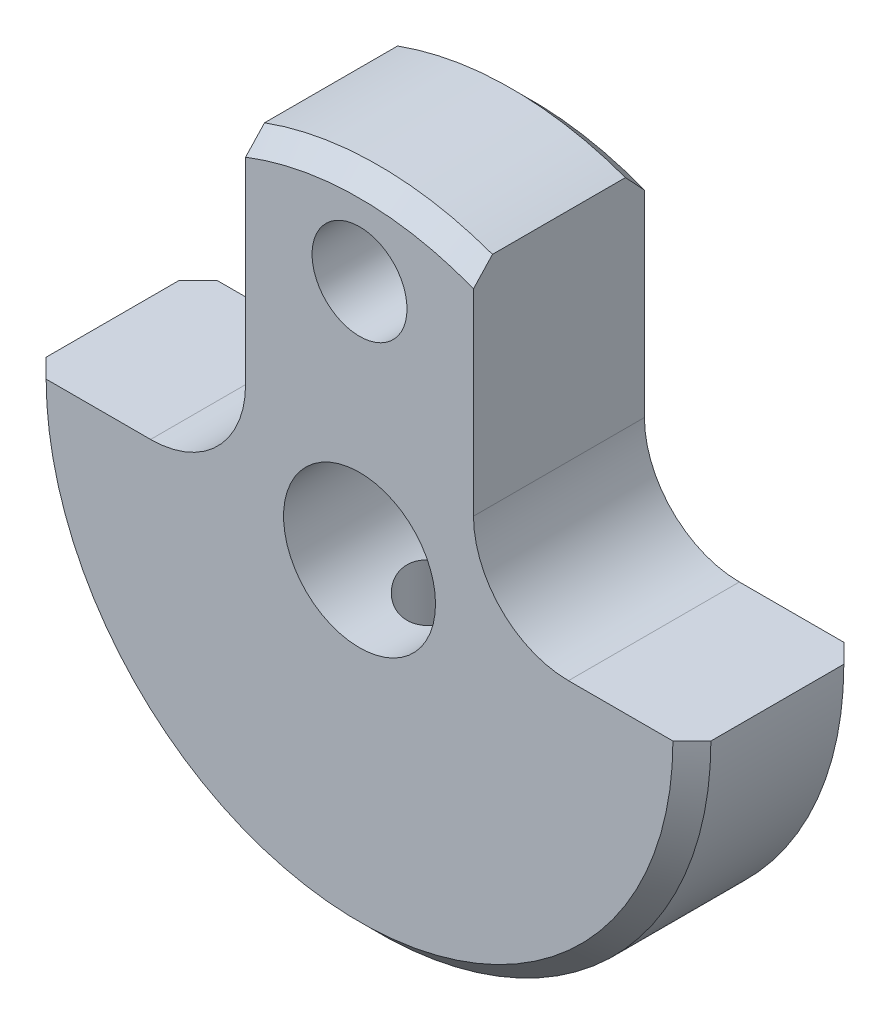
ISO-10303-21;
HEADER;
FILE_DESCRIPTION(('STEP AP214'),'2;1');
FILE_NAME('part.step','',(''),(''),'','','');
FILE_SCHEMA(('AUTOMOTIVE_DESIGN { 1 0 10303 214 1 1 1 1 }'));
ENDSEC;
DATA;
#1=APPLICATION_CONTEXT('core data for automotive mechanical design processes');
#2=APPLICATION_PROTOCOL_DEFINITION('international standard','automotive_design',2000,#1);
#3=PRODUCT_CONTEXT('',#1,'mechanical');
#4=PRODUCT('Part','Part','',(#3));
#5=PRODUCT_RELATED_PRODUCT_CATEGORY('part','',(#4));
#6=PRODUCT_DEFINITION_FORMATION('','',#4);
#7=PRODUCT_DEFINITION_CONTEXT('part definition',#1,'design');
#8=PRODUCT_DEFINITION('design','',#6,#7);
#9=PRODUCT_DEFINITION_SHAPE('','',#8);
#10=(LENGTH_UNIT() NAMED_UNIT(*) SI_UNIT(.MILLI.,.METRE.));
#11=(NAMED_UNIT(*) PLANE_ANGLE_UNIT() SI_UNIT($,.RADIAN.));
#12=(NAMED_UNIT(*) SI_UNIT($,.STERADIAN.) SOLID_ANGLE_UNIT());
#13=UNCERTAINTY_MEASURE_WITH_UNIT(LENGTH_MEASURE(1.E-05),#10,'distance_accuracy_value','');
#14=(GEOMETRIC_REPRESENTATION_CONTEXT(3) GLOBAL_UNCERTAINTY_ASSIGNED_CONTEXT((#13)) GLOBAL_UNIT_ASSIGNED_CONTEXT((#10,
#11,#12)) REPRESENTATION_CONTEXT('',''));
#15=CARTESIAN_POINT('',(0.,0.,0.));
#16=DIRECTION('',(0.,0.,1.));
#17=DIRECTION('',(1.,0.,0.));
#18=AXIS2_PLACEMENT_3D('',#15,#16,#17);
#19=CARTESIAN_POINT('',(0.,0.,4.5));
#20=DIRECTION('',(0.,0.,-1.));
#21=DIRECTION('',(-1.,0.,0.));
#22=AXIS2_PLACEMENT_3D('',#19,#20,#21);
#23=CYLINDRICAL_SURFACE('',#22,17.5);
#24=DIRECTION('',(0.,0.,-1.));
#25=VECTOR('',#24,1.);
#26=CARTESIAN_POINT('',(6.,16.4392822227736,4.5));
#27=LINE('',#26,#25);
#28=CARTESIAN_POINT('',(6.,16.4392822227736,3.49999999999998));
#29=VERTEX_POINT('',#28);
#30=CARTESIAN_POINT('',(6.,16.4392822227736,-3.5));
#31=VERTEX_POINT('',#30);
#32=EDGE_CURVE('E181',#29,#31,#27,.T.);
#33=ORIENTED_EDGE('',*,*,#32,.T.);
#34=CARTESIAN_POINT('',(0.,0.,-3.5));
#35=DIRECTION('',(0.,0.,1.));
#36=DIRECTION('',(1.,0.,0.));
#37=AXIS2_PLACEMENT_3D('',#34,#35,#36);
#38=CIRCLE('',#37,17.5);
#39=CARTESIAN_POINT('',(-6.,16.4392822227736,-3.5));
#40=VERTEX_POINT('',#39);
#41=EDGE_CURVE('E338',#31,#40,#38,.T.);
#42=ORIENTED_EDGE('',*,*,#41,.T.);
#43=DIRECTION('',(0.,0.,-1.));
#44=VECTOR('',#43,1.);
#45=CARTESIAN_POINT('',(-6.,16.4392822227736,4.5));
#46=LINE('',#45,#44);
#47=CARTESIAN_POINT('',(-6.,16.4392822227736,3.49999999999998));
#48=VERTEX_POINT('',#47);
#49=EDGE_CURVE('E159',#48,#40,#46,.T.);
#50=ORIENTED_EDGE('',*,*,#49,.F.);
#51=CARTESIAN_POINT('',(0.,0.,3.49999999999998));
#52=DIRECTION('',(0.,0.,1.));
#53=DIRECTION('',(1.,0.,0.));
#54=AXIS2_PLACEMENT_3D('',#51,#52,#53);
#55=CIRCLE('',#54,17.5);
#56=EDGE_CURVE('E222',#48,#29,#55,.F.);
#57=ORIENTED_EDGE('',*,*,#56,.T.);
#58=EDGE_LOOP('',(#33,#42,#50,#57));
#59=FACE_BOUND('',#58,.T.);
#60=ADVANCED_FACE('F45',(#59),#23,.T.);
#61=CARTESIAN_POINT('',(-6.,16.4392822227736,4.5));
#62=DIRECTION('',(1.,0.,0.));
#63=DIRECTION('',(0.,1.,0.));
#64=AXIS2_PLACEMENT_3D('',#61,#62,#63);
#65=PLANE('',#64);
#66=ORIENTED_EDGE('',*,*,#49,.T.);
#67=CARTESIAN_POINT('',(-6.,16.4392822227736,-3.5));
#68=CARTESIAN_POINT('',(-6.,16.2614879278329,-3.6670390275826));
#69=CARTESIAN_POINT('',(-6.,16.0835194437437,-3.83389187203582));
#70=CARTESIAN_POINT('',(-6.,15.7272340858214,-4.16722520539308));
#71=CARTESIAN_POINT('',(-6.,15.5489172119658,-4.33370569427319));
#72=CARTESIAN_POINT('',(-6.,15.3704261489394,-4.5));
#73=B_SPLINE_CURVE_WITH_KNOTS('',3,(#67,#68,#69,#70,#71,#72),.UNSPECIFIED.,.F.,.F.,(4,2,4),(0.,
0.731856459478371,1.46371296598383),.UNSPECIFIED.);
#74=CARTESIAN_POINT('',(-6.,15.3704261489394,-4.5));
#75=VERTEX_POINT('',#74);
#76=EDGE_CURVE('E279',#40,#75,#73,.T.);
#77=ORIENTED_EDGE('',*,*,#76,.T.);
#78=DIRECTION('',(0.,-1.,0.));
#79=VECTOR('',#78,1.);
#80=CARTESIAN_POINT('',(-6.,16.4392822227736,-4.5));
#81=LINE('',#80,#79);
#82=CARTESIAN_POINT('',(-6.,5.,-4.5));
#83=VERTEX_POINT('',#82);
#84=EDGE_CURVE('E155',#75,#83,#81,.T.);
#85=ORIENTED_EDGE('',*,*,#84,.T.);
#86=DIRECTION('',(0.,0.,-1.));
#87=VECTOR('',#86,1.);
#88=CARTESIAN_POINT('',(-6.,5.,4.5));
#89=LINE('',#88,#87);
#90=CARTESIAN_POINT('',(-6.,5.,4.5));
#91=VERTEX_POINT('',#90);
#92=EDGE_CURVE('E151',#91,#83,#89,.T.);
#93=ORIENTED_EDGE('',*,*,#92,.F.);
#94=DIRECTION('',(0.,-1.,0.));
#95=VECTOR('',#94,1.);
#96=CARTESIAN_POINT('',(-6.,16.4392822227736,4.5));
#97=LINE('',#96,#95);
#98=CARTESIAN_POINT('',(-6.,15.3704261489394,4.5));
#99=VERTEX_POINT('',#98);
#100=EDGE_CURVE('E136',#99,#91,#97,.T.);
#101=ORIENTED_EDGE('',*,*,#100,.F.);
#102=CARTESIAN_POINT('',(-6.,15.3704261489394,4.5));
#103=CARTESIAN_POINT('',(-6.,15.5489172119658,4.33370569427319));
#104=CARTESIAN_POINT('',(-6.,15.7272340858214,4.16722520539308));
#105=CARTESIAN_POINT('',(-6.,16.0835194437437,3.83389187203581));
#106=CARTESIAN_POINT('',(-6.,16.2614879278329,3.66703902758258));
#107=CARTESIAN_POINT('',(-6.,16.4392822227736,3.49999999999998));
#108=B_SPLINE_CURVE_WITH_KNOTS('',3,(#102,#103,#104,#105,#106,#107),.UNSPECIFIED.,.F.,.F.,(4,2,
4),(0.,0.731856506505467,1.46371296598385),.UNSPECIFIED.);
#109=EDGE_CURVE('E272',#99,#48,#108,.T.);
#110=ORIENTED_EDGE('',*,*,#109,.T.);
#111=EDGE_LOOP('',(#66,#77,#85,#93,#101,#110));
#112=FACE_BOUND('',#111,.T.);
#113=ADVANCED_FACE('F153',(#112),#65,.F.);
#114=CARTESIAN_POINT('',(-11.,5.,4.5));
#115=DIRECTION('',(0.,0.,-1.));
#116=DIRECTION('',(-1.,0.,0.));
#117=AXIS2_PLACEMENT_3D('',#114,#115,#116);
#118=CYLINDRICAL_SURFACE('',#117,5.);
#119=CARTESIAN_POINT('',(-11.,5.,-4.5));
#120=DIRECTION('',(0.,0.,-1.));
#121=DIRECTION('',(1.,0.,0.));
#122=AXIS2_PLACEMENT_3D('',#119,#120,#121);
#123=CIRCLE('',#122,5.);
#124=CARTESIAN_POINT('',(-11.,0.,-4.5));
#125=VERTEX_POINT('',#124);
#126=EDGE_CURVE('E184',#83,#125,#123,.T.);
#127=ORIENTED_EDGE('',*,*,#126,.T.);
#128=DIRECTION('',(0.,0.,-1.));
#129=VECTOR('',#128,1.);
#130=CARTESIAN_POINT('',(-11.,0.,4.5));
#131=LINE('',#130,#129);
#132=CARTESIAN_POINT('',(-11.,0.,4.5));
#133=VERTEX_POINT('',#132);
#134=EDGE_CURVE('E160',#133,#125,#131,.T.);
#135=ORIENTED_EDGE('',*,*,#134,.F.);
#136=CARTESIAN_POINT('',(-11.,5.,4.5));
#137=DIRECTION('',(0.,0.,-1.));
#138=DIRECTION('',(1.,0.,0.));
#139=AXIS2_PLACEMENT_3D('',#136,#137,#138);
#140=CIRCLE('',#139,5.);
#141=EDGE_CURVE('E142',#91,#133,#140,.T.);
#142=ORIENTED_EDGE('',*,*,#141,.F.);
#143=ORIENTED_EDGE('',*,*,#92,.T.);
#144=EDGE_LOOP('',(#127,#135,#142,#143));
#145=FACE_BOUND('',#144,.T.);
#146=ADVANCED_FACE('F162',(#145),#118,.F.);
#147=CARTESIAN_POINT('',(-11.,0.,4.5));
#148=DIRECTION('',(0.,-1.,0.));
#149=DIRECTION('',(0.,0.,-1.));
#150=AXIS2_PLACEMENT_3D('',#147,#148,#149);
#151=PLANE('',#150);
#152=DIRECTION('',(-1.,0.,0.));
#153=VECTOR('',#152,1.);
#154=CARTESIAN_POINT('',(-11.,0.,-4.5));
#155=LINE('',#154,#153);
#156=CARTESIAN_POINT('',(-16.5,0.,-4.5));
#157=VERTEX_POINT('',#156);
#158=EDGE_CURVE('E188',#125,#157,#155,.T.);
#159=ORIENTED_EDGE('',*,*,#158,.T.);
#160=DIRECTION('',(0.707106781186547,0.,-0.707106781186548));
#161=VECTOR('',#160,1.);
#162=CARTESIAN_POINT('',(0.,0.,-21.));
#163=LINE('',#162,#161);
#164=CARTESIAN_POINT('',(-17.5,0.,-3.49999999999999));
#165=VERTEX_POINT('',#164);
#166=EDGE_CURVE('E11',#157,#165,#163,.F.);
#167=ORIENTED_EDGE('',*,*,#166,.T.);
#168=DIRECTION('',(0.,0.,-1.));
#169=VECTOR('',#168,1.);
#170=CARTESIAN_POINT('',(-17.5,0.,4.5));
#171=LINE('',#170,#169);
#172=CARTESIAN_POINT('',(-17.5,0.,3.49999999999999));
#173=VERTEX_POINT('',#172);
#174=EDGE_CURVE('E215',#173,#165,#171,.T.);
#175=ORIENTED_EDGE('',*,*,#174,.F.);
#176=DIRECTION('',(-0.707106781186549,0.,-0.707106781186546));
#177=VECTOR('',#176,1.);
#178=CARTESIAN_POINT('',(0.,0.,20.9999999999999));
#179=LINE('',#178,#177);
#180=CARTESIAN_POINT('',(-16.5,0.,4.5));
#181=VERTEX_POINT('',#180);
#182=EDGE_CURVE('E55',#173,#181,#179,.F.);
#183=ORIENTED_EDGE('',*,*,#182,.T.);
#184=DIRECTION('',(-1.,0.,0.));
#185=VECTOR('',#184,1.);
#186=CARTESIAN_POINT('',(-11.,0.,4.5));
#187=LINE('',#186,#185);
#188=EDGE_CURVE('E166',#133,#181,#187,.T.);
#189=ORIENTED_EDGE('',*,*,#188,.F.);
#190=ORIENTED_EDGE('',*,*,#134,.T.);
#191=EDGE_LOOP('',(#159,#167,#175,#183,#189,#190));
#192=FACE_BOUND('',#191,.T.);
#193=ADVANCED_FACE('F259',(#192),#151,.F.);
#194=CARTESIAN_POINT('',(0.,0.,4.5));
#195=DIRECTION('',(0.,0.,-1.));
#196=DIRECTION('',(-1.,0.,0.));
#197=AXIS2_PLACEMENT_3D('',#194,#195,#196);
#198=CYLINDRICAL_SURFACE('',#197,17.5);
#199=CARTESIAN_POINT('',(0.,-17.5,2.));
#200=CARTESIAN_POINT('',(0.111949281131271,-17.4999985510682,1.99999519972221));
#201=CARTESIAN_POINT('',(0.223970370284168,-17.4989143966958,1.9905688469133));
#202=CARTESIAN_POINT('',(0.444900622583234,-17.4946937577693,1.95311111433452));
#203=CARTESIAN_POINT('',(0.553806324423903,-17.4915550764498,1.92505981972606));
#204=CARTESIAN_POINT('',(0.765274995712128,-17.4835792974507,1.85118493954277));
#205=CARTESIAN_POINT('',(0.867841986694445,-17.4787432899077,1.80537275922766));
#206=CARTESIAN_POINT('',(1.06381060236176,-17.4679120331755,1.69730025928979));
#207=CARTESIAN_POINT('',(1.15721390847253,-17.4619169972561,1.63504296491735));
#208=CARTESIAN_POINT('',(1.33265783514777,-17.4494069384049,1.49553827629261));
#209=CARTESIAN_POINT('',(1.41464987662083,-17.4428898679339,1.41822996562049));
#210=CARTESIAN_POINT('',(1.56452579579969,-17.4300869526196,1.25094824366483));
#211=CARTESIAN_POINT('',(1.63240898570475,-17.4238011190613,1.16097421529119));
#212=CARTESIAN_POINT('',(1.75231750467917,-17.4121519566138,0.970604232540961));
#213=CARTESIAN_POINT('',(1.80429797266076,-17.4067912557056,0.870179846835984));
#214=CARTESIAN_POINT('',(1.89063905410776,-17.3976257108765,0.661956037568454));
#215=CARTESIAN_POINT('',(1.92500022892039,-17.3938208173886,0.554156849089708));
#216=CARTESIAN_POINT('',(1.97498120601605,-17.3882168566911,0.334744186795485));
#217=CARTESIAN_POINT('',(1.99068245631194,-17.3864090748178,0.223149492773668));
#218=CARTESIAN_POINT('',(2.00314979639016,-17.3849772070577,-0.00110459341705598));
#219=CARTESIAN_POINT('',(1.99991652712141,-17.3853530472536,-0.1137639494174));
#220=CARTESIAN_POINT('',(1.9746735877826,-17.3882379876878,-0.336384576951136));
#221=CARTESIAN_POINT('',(1.95275327430006,-17.3907369355841,-0.446356130792127));
#222=CARTESIAN_POINT('',(1.89089772862114,-17.3975706833084,-0.661049381098405));
#223=CARTESIAN_POINT('',(1.85096218648165,-17.4019055147219,-0.765770987206493));
#224=CARTESIAN_POINT('',(1.75411258690629,-17.4119342022004,-0.967271409063269));
#225=CARTESIAN_POINT('',(1.697159329054,-17.4176311898807,-1.0640312212313));
#226=CARTESIAN_POINT('',(1.5679190891396,-17.4297397716759,-1.24665329274372));
#227=CARTESIAN_POINT('',(1.49563152051157,-17.4361513931222,-1.33251513501963));
#228=CARTESIAN_POINT('',(1.33727766100704,-17.4490120091816,-1.49142289169273));
#229=CARTESIAN_POINT('',(1.25113428048549,-17.4554610059959,-1.56439200697674));
#230=CARTESIAN_POINT('',(1.06778054344645,-17.4676349914203,-1.69484625362185));
#231=CARTESIAN_POINT('',(0.970570168013122,-17.4733599787928,-1.75233135851693));
#232=CARTESIAN_POINT('',(0.767785399909199,-17.4834436495983,-1.85018441798749));
#233=CARTESIAN_POINT('',(0.662208868897606,-17.487801982302,-1.89054797953882));
#234=CARTESIAN_POINT('',(0.445716005555924,-17.4946579437091,-1.95295335032392));
#235=CARTESIAN_POINT('',(0.33479988217787,-17.4971556451608,-1.97499587589154));
#236=CARTESIAN_POINT('',(0.111440847189143,-17.4999995196358,-2.00003489194185));
#237=CARTESIAN_POINT('',(-0.000990049263884275,-17.5003576527763,-2.00313725942906));
#238=CARTESIAN_POINT('',(-0.224770143214528,-17.4989142301576,-1.99048670077362));
#239=CARTESIAN_POINT('',(-0.336119359859263,-17.4971127126976,-1.97473410900327));
#240=CARTESIAN_POINT('',(-0.554265994438542,-17.4915599395695,-1.9249086964044));
#241=CARTESIAN_POINT('',(-0.661074995715398,-17.4878140135584,-1.89088594563397));
#242=CARTESIAN_POINT('',(-0.86747060654654,-17.4787921749894,-1.80553777762337));
#243=CARTESIAN_POINT('',(-0.967057008006426,-17.4735162183709,-1.75421186209241));
#244=CARTESIAN_POINT('',(-1.1566560556988,-17.4619935546906,-1.63545523933527));
#245=CARTESIAN_POINT('',(-1.24662524248109,-17.4557427309721,-1.56795555368873));
#246=CARTESIAN_POINT('',(-1.41399482686995,-17.4429836190554,-1.41886564059422));
#247=CARTESIAN_POINT('',(-1.49139480973755,-17.4364753223705,-1.33727494837641));
#248=CARTESIAN_POINT('',(-1.63180089287333,-17.4238982965486,-1.16185467559832));
#249=CARTESIAN_POINT('',(-1.69473712215655,-17.4178317940395,-1.06796898786935));
#250=CARTESIAN_POINT('',(-1.80394755942104,-17.4068606742743,-0.870898077949681));
#251=CARTESIAN_POINT('',(-1.85022205420212,-17.4019560370195,-0.767713015868109));
#252=CARTESIAN_POINT('',(-1.92468057699606,-17.3938786287494,-0.555204287235232));
#253=CARTESIAN_POINT('',(-1.9529049884149,-17.3907019940762,-0.445894923210457));
#254=CARTESIAN_POINT('',(-1.99059267414119,-17.3864287991637,-0.22404998907473));
#255=CARTESIAN_POINT('',(-2.00005666745658,-17.385332159207,-0.111514542773653));
#256=CARTESIAN_POINT('',(-1.99994314687055,-17.385345163739,0.112893307638868));
#257=CARTESIAN_POINT('',(-1.99047539100516,-17.3864420908835,0.224765784023057));
#258=CARTESIAN_POINT('',(-1.95299850876729,-17.3906913968281,0.44531898808805));
#259=CARTESIAN_POINT('',(-1.92498937098975,-17.3938437768924,0.553999713805521));
#260=CARTESIAN_POINT('',(-1.85125733006852,-17.4018450488478,0.765076043362252));
#261=CARTESIAN_POINT('',(-1.80553879088569,-17.4066935227579,0.867473188409542));
#262=CARTESIAN_POINT('',(-1.69769666392679,-17.4175414489812,1.06315918160624));
#263=CARTESIAN_POINT('',(-1.63557300493567,-17.4235409062907,1.15644799021371));
#264=CARTESIAN_POINT('',(-1.496274276119,-17.4360565183282,1.33183113362611));
#265=CARTESIAN_POINT('',(-1.41901733601474,-17.4425753637158,1.41386025390555));
#266=CARTESIAN_POINT('',(-1.25181311513089,-17.4553710614581,1.56383427394015));
#267=CARTESIAN_POINT('',(-1.16186282631113,-17.4616478560018,1.63177582580489));
#268=CARTESIAN_POINT('',(-0.971500170550116,-17.4732739611811,1.75182617233102));
#269=CARTESIAN_POINT('',(-0.871055194164788,-17.4786202345149,1.80388352106762));
#270=CARTESIAN_POINT('',(-0.662847939396798,-17.4877513427388,1.8903202121152));
#271=CARTESIAN_POINT('',(-0.555093898848711,-17.4915379025678,1.92471909393972));
#272=CARTESIAN_POINT('',(-0.372298085692646,-17.4961924479184,1.96647110226512));
#273=CARTESIAN_POINT('',(-0.298416630910324,-17.4976134605341,1.97902677875614));
#274=CARTESIAN_POINT('',(-0.149700818660187,-17.499517718344,1.99579280851968));
#275=CARTESIAN_POINT('',(-0.0748664667225642,-17.5000009689781,2.00000321020228));
#276=CARTESIAN_POINT('',(0.,-17.5,2.));
#277=B_SPLINE_CURVE_WITH_KNOTS('',3,(#199,#200,#201,#202,#203,#204,#205,#206,#207,#208,#209,
#210,#211,#212,#213,#214,#215,#216,#217,#218,#219,#220,#221,#222,#223,#224,#225,#226,#227,#228,
#229,#230,#231,#232,#233,#234,#235,#236,#237,#238,#239,#240,#241,#242,#243,#244,#245,#246,#247,
#248,#249,#250,#251,#252,#253,#254,#255,#256,#257,#258,#259,#260,#261,#262,#263,#264,#265,#266,
#267,#268,#269,#270,#271,#272,#273,#274,#275,#276),.UNSPECIFIED.,.T.,.F.,(4,2,2,2,2,2,2,2,2,2,2,
2,2,2,2,2,2,2,2,2,2,2,2,2,2,2,2,2,2,2,2,2,2,2,2,2,2,2,4),(0.,0.33557441666428,0.671508227518322,
1.00722667281621,1.34288340216198,1.67992799894876,2.01698902267013,2.3549922992977,
2.69298480653802,3.02949654002249,3.36599688237659,3.70089713523239,4.03580315010126,
4.3714866496878,4.7071829921089,5.04481612297898,5.38244983094421,5.72017011621975,
6.05787719635448,6.39369472529332,6.72950629895979,7.06440223033912,7.3993078067643,
7.73566795085562,8.07203919137998,8.41000271890796,8.74796042876378,9.08515935679784,
9.42234536116483,9.75758217571838,10.0928191964808,10.4279736604432,10.763129579344,
11.100151413458,11.4372532487619,11.7754355791756,12.1132428917892,12.3376607387197,
12.5620772838218),.UNSPECIFIED.);
#278=CARTESIAN_POINT('',(0.,-17.5,2.));
#279=VERTEX_POINT('',#278);
#280=EDGE_CURVE('E232',#279,#279,#277,.T.);
#281=ORIENTED_EDGE('',*,*,#280,.T.);
#282=EDGE_LOOP('',(#281));
#283=FACE_BOUND('',#282,.T.);
#284=ORIENTED_EDGE('',*,*,#174,.T.);
#285=CARTESIAN_POINT('',(0.,0.,-3.49999999999999));
#286=DIRECTION('',(0.,0.,1.));
#287=DIRECTION('',(1.,0.,0.));
#288=AXIS2_PLACEMENT_3D('',#285,#286,#287);
#289=CIRCLE('',#288,17.5);
#290=CARTESIAN_POINT('',(17.5,0.,-3.49999999999999));
#291=VERTEX_POINT('',#290);
#292=EDGE_CURVE('E362',#165,#291,#289,.T.);
#293=ORIENTED_EDGE('',*,*,#292,.T.);
#294=DIRECTION('',(0.,0.,-1.));
#295=VECTOR('',#294,1.);
#296=CARTESIAN_POINT('',(17.5,0.,4.5));
#297=LINE('',#296,#295);
#298=CARTESIAN_POINT('',(17.5,0.,3.49999999999999));
#299=VERTEX_POINT('',#298);
#300=EDGE_CURVE('E211',#299,#291,#297,.T.);
#301=ORIENTED_EDGE('',*,*,#300,.F.);
#302=CARTESIAN_POINT('',(0.,0.,3.49999999999999));
#303=DIRECTION('',(0.,0.,1.));
#304=DIRECTION('',(1.,0.,0.));
#305=AXIS2_PLACEMENT_3D('',#302,#303,#304);
#306=CIRCLE('',#305,17.5);
#307=EDGE_CURVE('E67',#299,#173,#306,.F.);
#308=ORIENTED_EDGE('',*,*,#307,.T.);
#309=EDGE_LOOP('',(#284,#293,#301,#308));
#310=FACE_BOUND('',#309,.T.);
#311=ADVANCED_FACE('F253',(#283,#310),#198,.T.);
#312=CARTESIAN_POINT('',(11.,0.,4.5));
#313=DIRECTION('',(0.,-1.,0.));
#314=DIRECTION('',(0.,0.,-1.));
#315=AXIS2_PLACEMENT_3D('',#312,#313,#314);
#316=PLANE('',#315);
#317=ORIENTED_EDGE('',*,*,#300,.T.);
#318=DIRECTION('',(0.707106781186547,0.,0.707106781186548));
#319=VECTOR('',#318,1.);
#320=CARTESIAN_POINT('',(0.,0.,-21.));
#321=LINE('',#320,#319);
#322=CARTESIAN_POINT('',(16.5,0.,-4.5));
#323=VERTEX_POINT('',#322);
#324=EDGE_CURVE('E363',#291,#323,#321,.F.);
#325=ORIENTED_EDGE('',*,*,#324,.T.);
#326=DIRECTION('',(-1.,0.,0.));
#327=VECTOR('',#326,1.);
#328=CARTESIAN_POINT('',(11.,0.,-4.5));
#329=LINE('',#328,#327);
#330=CARTESIAN_POINT('',(11.,0.,-4.5));
#331=VERTEX_POINT('',#330);
#332=EDGE_CURVE('E191',#323,#331,#329,.T.);
#333=ORIENTED_EDGE('',*,*,#332,.T.);
#334=DIRECTION('',(0.,0.,-1.));
#335=VECTOR('',#334,1.);
#336=CARTESIAN_POINT('',(11.,0.,4.5));
#337=LINE('',#336,#335);
#338=CARTESIAN_POINT('',(11.,0.,4.5));
#339=VERTEX_POINT('',#338);
#340=EDGE_CURVE('E207',#339,#331,#337,.T.);
#341=ORIENTED_EDGE('',*,*,#340,.F.);
#342=DIRECTION('',(-1.,0.,0.));
#343=VECTOR('',#342,1.);
#344=CARTESIAN_POINT('',(11.,0.,4.5));
#345=LINE('',#344,#343);
#346=CARTESIAN_POINT('',(16.5,0.,4.5));
#347=VERTEX_POINT('',#346);
#348=EDGE_CURVE('E169',#347,#339,#345,.T.);
#349=ORIENTED_EDGE('',*,*,#348,.F.);
#350=DIRECTION('',(-0.707106781186549,0.,0.707106781186546));
#351=VECTOR('',#350,1.);
#352=CARTESIAN_POINT('',(0.,0.,20.9999999999999));
#353=LINE('',#352,#351);
#354=EDGE_CURVE('E365',#347,#299,#353,.F.);
#355=ORIENTED_EDGE('',*,*,#354,.T.);
#356=EDGE_LOOP('',(#317,#325,#333,#341,#349,#355));
#357=FACE_BOUND('',#356,.T.);
#358=ADVANCED_FACE('F258',(#357),#316,.F.);
#359=CARTESIAN_POINT('',(11.,5.,4.5));
#360=DIRECTION('',(0.,0.,-1.));
#361=DIRECTION('',(-1.,0.,0.));
#362=AXIS2_PLACEMENT_3D('',#359,#360,#361);
#363=CYLINDRICAL_SURFACE('',#362,5.);
#364=CARTESIAN_POINT('',(11.,5.,-4.5));
#365=DIRECTION('',(0.,0.,-1.));
#366=DIRECTION('',(-1.,0.,0.));
#367=AXIS2_PLACEMENT_3D('',#364,#365,#366);
#368=CIRCLE('',#367,5.);
#369=CARTESIAN_POINT('',(6.,5.00000000000003,-4.5));
#370=VERTEX_POINT('',#369);
#371=EDGE_CURVE('E194',#331,#370,#368,.T.);
#372=ORIENTED_EDGE('',*,*,#371,.T.);
#373=DIRECTION('',(0.,0.,-1.));
#374=VECTOR('',#373,1.);
#375=CARTESIAN_POINT('',(6.,5.00000000000003,4.5));
#376=LINE('',#375,#374);
#377=CARTESIAN_POINT('',(6.,5.00000000000003,4.5));
#378=VERTEX_POINT('',#377);
#379=EDGE_CURVE('E203',#378,#370,#376,.T.);
#380=ORIENTED_EDGE('',*,*,#379,.F.);
#381=CARTESIAN_POINT('',(11.,5.,4.5));
#382=DIRECTION('',(0.,0.,-1.));
#383=DIRECTION('',(-1.,0.,0.));
#384=AXIS2_PLACEMENT_3D('',#381,#382,#383);
#385=CIRCLE('',#384,5.);
#386=EDGE_CURVE('E175',#339,#378,#385,.T.);
#387=ORIENTED_EDGE('',*,*,#386,.F.);
#388=ORIENTED_EDGE('',*,*,#340,.T.);
#389=EDGE_LOOP('',(#372,#380,#387,#388));
#390=FACE_BOUND('',#389,.T.);
#391=ADVANCED_FACE('F319',(#390),#363,.F.);
#392=CARTESIAN_POINT('',(6.,16.4392822227736,4.5));
#393=DIRECTION('',(-1.,0.,0.));
#394=DIRECTION('',(0.,-1.,0.));
#395=AXIS2_PLACEMENT_3D('',#392,#393,#394);
#396=PLANE('',#395);
#397=DIRECTION('',(0.,1.,0.));
#398=VECTOR('',#397,1.);
#399=CARTESIAN_POINT('',(6.,16.4392822227736,-4.5));
#400=LINE('',#399,#398);
#401=CARTESIAN_POINT('',(6.,15.3704261489394,-4.5));
#402=VERTEX_POINT('',#401);
#403=EDGE_CURVE('E148',#370,#402,#400,.T.);
#404=ORIENTED_EDGE('',*,*,#403,.T.);
#405=CARTESIAN_POINT('',(6.,15.3704261489394,-4.5));
#406=CARTESIAN_POINT('',(6.,15.5489172119658,-4.33370569427319));
#407=CARTESIAN_POINT('',(6.,15.7272340858214,-4.16722520539308));
#408=CARTESIAN_POINT('',(6.,16.0835194437437,-3.83389187203582));
#409=CARTESIAN_POINT('',(6.,16.2614879278329,-3.6670390275826));
#410=CARTESIAN_POINT('',(6.,16.4392822227736,-3.5));
#411=B_SPLINE_CURVE_WITH_KNOTS('',3,(#405,#406,#407,#408,#409,#410),.UNSPECIFIED.,.F.,.F.,(4,2,
4),(0.,0.731856506505456,1.46371296598383),.UNSPECIFIED.);
#412=EDGE_CURVE('E299',#402,#31,#411,.T.);
#413=ORIENTED_EDGE('',*,*,#412,.T.);
#414=ORIENTED_EDGE('',*,*,#32,.F.);
#415=CARTESIAN_POINT('',(6.,16.4392822227736,3.49999999999998));
#416=CARTESIAN_POINT('',(6.,16.2614879278329,3.66703902758258));
#417=CARTESIAN_POINT('',(6.,16.0835194437437,3.83389187203581));
#418=CARTESIAN_POINT('',(6.,15.7272340858214,4.16722520539308));
#419=CARTESIAN_POINT('',(6.,15.5489172119658,4.33370569427319));
#420=CARTESIAN_POINT('',(6.,15.3704261489394,4.5));
#421=B_SPLINE_CURVE_WITH_KNOTS('',3,(#415,#416,#417,#418,#419,#420),.UNSPECIFIED.,.F.,.F.,(4,2,
4),(0.,0.731856459478383,1.46371296598385),.UNSPECIFIED.);
#422=CARTESIAN_POINT('',(6.,15.3704261489394,4.5));
#423=VERTEX_POINT('',#422);
#424=EDGE_CURVE('E309',#29,#423,#421,.T.);
#425=ORIENTED_EDGE('',*,*,#424,.T.);
#426=DIRECTION('',(0.,1.,0.));
#427=VECTOR('',#426,1.);
#428=CARTESIAN_POINT('',(6.,16.4392822227736,4.5));
#429=LINE('',#428,#427);
#430=EDGE_CURVE('E178',#378,#423,#429,.T.);
#431=ORIENTED_EDGE('',*,*,#430,.F.);
#432=ORIENTED_EDGE('',*,*,#379,.T.);
#433=EDGE_LOOP('',(#404,#413,#414,#425,#431,#432));
#434=FACE_BOUND('',#433,.T.);
#435=ADVANCED_FACE('F315',(#434),#396,.F.);
#436=CARTESIAN_POINT('',(0.,0.,4.5));
#437=DIRECTION('',(0.,0.,1.));
#438=DIRECTION('',(1.,0.,0.));
#439=AXIS2_PLACEMENT_3D('',#436,#437,#438);
#440=PLANE('',#439);
#441=CARTESIAN_POINT('',(0.,0.,4.5));
#442=DIRECTION('',(0.,0.,1.));
#443=DIRECTION('',(1.,0.,0.));
#444=AXIS2_PLACEMENT_3D('',#441,#442,#443);
#445=CIRCLE('',#444,4.);
#446=CARTESIAN_POINT('',(4.,0.,4.5));
#447=VERTEX_POINT('',#446);
#448=EDGE_CURVE('E538',#447,#447,#445,.T.);
#449=ORIENTED_EDGE('',*,*,#448,.F.);
#450=EDGE_LOOP('',(#449));
#451=FACE_BOUND('',#450,.T.);
#452=CARTESIAN_POINT('',(0.,12.7,4.5));
#453=DIRECTION('',(0.,0.,1.));
#454=DIRECTION('',(1.,0.,0.));
#455=AXIS2_PLACEMENT_3D('',#452,#453,#454);
#456=CIRCLE('',#455,2.5);
#457=CARTESIAN_POINT('',(2.5,12.7,4.5));
#458=VERTEX_POINT('',#457);
#459=EDGE_CURVE('E541',#458,#458,#456,.T.);
#460=ORIENTED_EDGE('',*,*,#459,.F.);
#461=EDGE_LOOP('',(#460));
#462=FACE_BOUND('',#461,.T.);
#463=ORIENTED_EDGE('',*,*,#430,.T.);
#464=CARTESIAN_POINT('',(0.,0.,4.5));
#465=DIRECTION('',(0.,0.,1.));
#466=DIRECTION('',(1.,0.,0.));
#467=AXIS2_PLACEMENT_3D('',#464,#465,#466);
#468=CIRCLE('',#467,16.5);
#469=EDGE_CURVE('E145',#423,#99,#468,.T.);
#470=ORIENTED_EDGE('',*,*,#469,.T.);
#471=ORIENTED_EDGE('',*,*,#100,.T.);
#472=ORIENTED_EDGE('',*,*,#141,.T.);
#473=ORIENTED_EDGE('',*,*,#188,.T.);
#474=CARTESIAN_POINT('',(0.,0.,4.5));
#475=DIRECTION('',(0.,0.,1.));
#476=DIRECTION('',(1.,0.,0.));
#477=AXIS2_PLACEMENT_3D('',#474,#475,#476);
#478=CIRCLE('',#477,16.5);
#479=EDGE_CURVE('E308',#181,#347,#478,.T.);
#480=ORIENTED_EDGE('',*,*,#479,.T.);
#481=ORIENTED_EDGE('',*,*,#348,.T.);
#482=ORIENTED_EDGE('',*,*,#386,.T.);
#483=EDGE_LOOP('',(#463,#470,#471,#472,#473,#480,#481,#482));
#484=FACE_BOUND('',#483,.T.);
#485=ADVANCED_FACE('F139',(#451,#462,#484),#440,.T.);
#486=CARTESIAN_POINT('',(0.,0.,-4.5));
#487=DIRECTION('',(0.,0.,1.));
#488=DIRECTION('',(1.,0.,0.));
#489=AXIS2_PLACEMENT_3D('',#486,#487,#488);
#490=PLANE('',#489);
#491=CARTESIAN_POINT('',(0.,0.,-4.5));
#492=DIRECTION('',(0.,0.,1.));
#493=DIRECTION('',(1.,0.,0.));
#494=AXIS2_PLACEMENT_3D('',#491,#492,#493);
#495=CIRCLE('',#494,4.);
#496=CARTESIAN_POINT('',(4.,0.,-4.5));
#497=VERTEX_POINT('',#496);
#498=EDGE_CURVE('E185',#497,#497,#495,.T.);
#499=ORIENTED_EDGE('',*,*,#498,.T.);
#500=EDGE_LOOP('',(#499));
#501=FACE_BOUND('',#500,.T.);
#502=CARTESIAN_POINT('',(0.,12.7,-4.5));
#503=DIRECTION('',(0.,0.,1.));
#504=DIRECTION('',(1.,0.,0.));
#505=AXIS2_PLACEMENT_3D('',#502,#503,#504);
#506=CIRCLE('',#505,2.5);
#507=CARTESIAN_POINT('',(2.5,12.7,-4.5));
#508=VERTEX_POINT('',#507);
#509=EDGE_CURVE('E251',#508,#508,#506,.T.);
#510=ORIENTED_EDGE('',*,*,#509,.T.);
#511=EDGE_LOOP('',(#510));
#512=FACE_BOUND('',#511,.T.);
#513=ORIENTED_EDGE('',*,*,#84,.F.);
#514=CARTESIAN_POINT('',(0.,0.,-4.5));
#515=DIRECTION('',(0.,0.,1.));
#516=DIRECTION('',(1.,0.,0.));
#517=AXIS2_PLACEMENT_3D('',#514,#515,#516);
#518=CIRCLE('',#517,16.5);
#519=EDGE_CURVE('E349',#75,#402,#518,.F.);
#520=ORIENTED_EDGE('',*,*,#519,.T.);
#521=ORIENTED_EDGE('',*,*,#403,.F.);
#522=ORIENTED_EDGE('',*,*,#371,.F.);
#523=ORIENTED_EDGE('',*,*,#332,.F.);
#524=CARTESIAN_POINT('',(0.,0.,-4.5));
#525=DIRECTION('',(0.,0.,1.));
#526=DIRECTION('',(1.,0.,0.));
#527=AXIS2_PLACEMENT_3D('',#524,#525,#526);
#528=CIRCLE('',#527,16.5);
#529=EDGE_CURVE('E286',#323,#157,#528,.F.);
#530=ORIENTED_EDGE('',*,*,#529,.T.);
#531=ORIENTED_EDGE('',*,*,#158,.F.);
#532=ORIENTED_EDGE('',*,*,#126,.F.);
#533=EDGE_LOOP('',(#513,#520,#521,#522,#523,#530,#531,#532));
#534=FACE_BOUND('',#533,.T.);
#535=ADVANCED_FACE('F321',(#501,#512,#534),#490,.F.);
#536=CARTESIAN_POINT('',(0.,12.7,-4.5));
#537=DIRECTION('',(0.,0.,1.));
#538=DIRECTION('',(1.,0.,0.));
#539=AXIS2_PLACEMENT_3D('',#536,#537,#538);
#540=CYLINDRICAL_SURFACE('',#539,2.5);
#541=ORIENTED_EDGE('',*,*,#509,.F.);
#542=EDGE_LOOP('',(#541));
#543=FACE_BOUND('',#542,.T.);
#544=ORIENTED_EDGE('',*,*,#459,.T.);
#545=EDGE_LOOP('',(#544));
#546=FACE_BOUND('',#545,.T.);
#547=ADVANCED_FACE('F415',(#543,#546),#540,.F.);
#548=CARTESIAN_POINT('',(0.,0.,-4.5));
#549=DIRECTION('',(0.,0.,1.));
#550=DIRECTION('',(1.,0.,0.));
#551=AXIS2_PLACEMENT_3D('',#548,#549,#550);
#552=CYLINDRICAL_SURFACE('',#551,4.);
#553=CARTESIAN_POINT('',(0.,-4.,2.));
#554=CARTESIAN_POINT('',(-0.105143925902467,-3.99999426810082,1.99999339536562));
#555=CARTESIAN_POINT('',(-0.210413199395125,-3.99580982039513,1.99165985375789));
#556=CARTESIAN_POINT('',(-0.417840470537792,-3.97948312074314,1.95869423931692));
#557=CARTESIAN_POINT('',(-0.519992173427259,-3.96732575657839,1.93403121400437));
#558=CARTESIAN_POINT('',(-0.717867089760898,-3.93632558806751,1.86961238276674));
#559=CARTESIAN_POINT('',(-0.813613605878293,-3.91750878355075,1.82991523150406));
#560=CARTESIAN_POINT('',(-0.996945233613197,-3.87491553031523,1.73685875727003));
#561=CARTESIAN_POINT('',(-1.08453098798012,-3.8511394726705,1.68350051150227));
#562=CARTESIAN_POINT('',(-1.25501563552382,-3.79912516516124,1.56096550102943));
#563=CARTESIAN_POINT('',(-1.33731042224422,-3.77070398255074,1.49102704152072));
#564=CARTESIAN_POINT('',(-1.48955888973396,-3.71319940493486,1.33895704150593));
#565=CARTESIAN_POINT('',(-1.55950316621353,-3.68411552418069,1.25681629645512));
#566=CARTESIAN_POINT('',(-1.69050400090056,-3.62597902394695,1.07503330095324));
#567=CARTESIAN_POINT('',(-1.75045067110327,-3.59710373940264,0.974527803308175));
#568=CARTESIAN_POINT('',(-1.85233645378139,-3.54571957544641,0.76326532802757));
#569=CARTESIAN_POINT('',(-1.89428842993267,-3.52320615213979,0.652515742554501));
#570=CARTESIAN_POINT('',(-1.95626488437718,-3.48915734075617,0.430669789156155));
#571=CARTESIAN_POINT('',(-1.97745171416088,-3.47704543167427,0.319991095865211));
#572=CARTESIAN_POINT('',(-2.00085398661769,-3.46363779897055,0.0960423244410459));
#573=CARTESIAN_POINT('',(-2.00308817674615,-3.46233138686576,-0.0172250817423097));
#574=CARTESIAN_POINT('',(-1.98937457434459,-3.47021860514497,-0.228572048630737));
#575=CARTESIAN_POINT('',(-1.97556911907364,-3.47817527324027,-0.326848062446101));
#576=CARTESIAN_POINT('',(-1.93387969811386,-3.50152457467701,-0.519443818746085));
#577=CARTESIAN_POINT('',(-1.9059912477953,-3.51691957663553,-0.613762290610632));
#578=CARTESIAN_POINT('',(-1.83641956077201,-3.55374952825482,-0.798458265131319));
#579=CARTESIAN_POINT('',(-1.79443013423199,-3.57531681327997,-0.888692797571578));
#580=CARTESIAN_POINT('',(-1.698083375336,-3.62206808562807,-1.06126858518002));
#581=CARTESIAN_POINT('',(-1.64372048762493,-3.64725369560381,-1.14360627120018));
#582=CARTESIAN_POINT('',(-1.51613210982558,-3.70226315806572,-1.30904250548645));
#583=CARTESIAN_POINT('',(-1.44138891673856,-3.73227020473492,-1.39091374715231));
#584=CARTESIAN_POINT('',(-1.27911115748275,-3.79095246600814,-1.5414708371818));
#585=CARTESIAN_POINT('',(-1.19157051314857,-3.81962703917602,-1.61015038406776));
#586=CARTESIAN_POINT('',(-1.0010330116637,-3.87403974565928,-1.73537132205945));
#587=CARTESIAN_POINT('',(-0.897507183198818,-3.89957968324015,-1.79120094489148));
#588=CARTESIAN_POINT('',(-0.680932430977593,-3.94315762242485,-1.88419405808602));
#589=CARTESIAN_POINT('',(-0.567891152530552,-3.96120157887106,-1.92137237003033));
#590=CARTESIAN_POINT('',(-0.345532983321404,-3.98648667482871,-1.97295080743335));
#591=CARTESIAN_POINT('',(-0.236683061096652,-3.9944987660262,-1.98898247149356));
#592=CARTESIAN_POINT('',(-0.0175591998987029,-4.00146026918207,-2.00292946226897));
#593=CARTESIAN_POINT('',(0.0927140397398176,-4.00041397442637,-2.00085337127894));
#594=CARTESIAN_POINT('',(0.302465943971974,-3.9898238450687,-1.97958662316251));
#595=CARTESIAN_POINT('',(0.40211881609986,-3.98094491376337,-1.96173493454001));
#596=CARTESIAN_POINT('',(0.596813784603882,-3.9564434262968,-1.91152385620976));
#597=CARTESIAN_POINT('',(0.691855371382174,-3.94082012668824,-1.87916286709301));
#598=CARTESIAN_POINT('',(0.877777216899146,-3.90368502827176,-1.80000306713393));
#599=CARTESIAN_POINT('',(0.968460794011607,-3.88201763539261,-1.75281789976743));
#600=CARTESIAN_POINT('',(1.14092272339854,-3.83487948634835,-1.64578492870686));
#601=CARTESIAN_POINT('',(1.22269725955318,-3.80940711133877,-1.58593173080921));
#602=CARTESIAN_POINT('',(1.38353537857843,-3.75416442672396,-1.44847914933857));
#603=CARTESIAN_POINT('',(1.46154415563805,-3.72421769686998,-1.36971426310971));
#604=CARTESIAN_POINT('',(1.60371264223771,-3.6652478321764,-1.20014969744454));
#605=CARTESIAN_POINT('',(1.66786277142375,-3.63622534800094,-1.10934176230416));
#606=CARTESIAN_POINT('',(1.78341582895804,-3.58102384412979,-0.912712691654048));
#607=CARTESIAN_POINT('',(1.8340509916005,-3.55505059178121,-0.806377467811037));
#608=CARTESIAN_POINT('',(1.91616565186941,-3.51148144588269,-0.584979864850068));
#609=CARTESIAN_POINT('',(1.94766983173403,-3.493874764435,-0.469928947066219));
#610=CARTESIAN_POINT('',(1.98772337493374,-3.47123002051604,-0.246179554230591));
#611=CARTESIAN_POINT('',(1.9981859928109,-3.4651476693013,-0.137931493129516));
#612=CARTESIAN_POINT('',(2.0013783087524,-3.46330709283206,0.0788941343290507));
#613=CARTESIAN_POINT('',(1.99411569324648,-3.4675443925278,0.187471537475724));
#614=CARTESIAN_POINT('',(1.96385225118662,-3.48475724102153,0.390967003066875));
#615=CARTESIAN_POINT('',(1.94241662868607,-3.49686188965317,0.48620094028948));
#616=CARTESIAN_POINT('',(1.88635071644882,-3.52742032375305,0.671616238848734));
#617=CARTESIAN_POINT('',(1.85171618231984,-3.54587615139337,0.761795964184064));
#618=CARTESIAN_POINT('',(1.76763149060113,-3.58857060729071,0.941249701973074));
#619=CARTESIAN_POINT('',(1.7173422756314,-3.61311444791841,1.03005580365806));
#620=CARTESIAN_POINT('',(1.60430194327478,-3.66470663269721,1.19854907236252));
#621=CARTESIAN_POINT('',(1.54154434248312,-3.69175627591221,1.27823146104222));
#622=CARTESIAN_POINT('',(1.39640665332275,-3.74924646316184,1.43628396470935));
#623=CARTESIAN_POINT('',(1.31256884599452,-3.77969966613256,1.51331820470058));
#624=CARTESIAN_POINT('',(1.13230961246639,-3.83755504519861,1.65252596687054));
#625=CARTESIAN_POINT('',(1.03588144661039,-3.8649555725239,1.71469147893981));
#626=CARTESIAN_POINT('',(0.83186319356589,-3.91396019133075,1.82247272542414));
#627=CARTESIAN_POINT('',(0.72419900755346,-3.93552192987866,1.86796833847294));
#628=CARTESIAN_POINT('',(0.501484202276172,-3.97002682597974,1.93961633551482));
#629=CARTESIAN_POINT('',(0.386455599178199,-3.98299446726136,1.96582369361143));
#630=CARTESIAN_POINT('',(0.22520389298179,-3.99390923826956,1.98779482217148));
#631=CARTESIAN_POINT('',(0.18032375888313,-3.99618730680502,1.99236528173268));
#632=CARTESIAN_POINT('',(0.0903034636101834,-3.99923393953631,1.99846933102817));
#633=CARTESIAN_POINT('',(0.045163295293257,-4.00000246206762,2.00000283694042));
#634=CARTESIAN_POINT('',(0.,-4.,2.));
#635=B_SPLINE_CURVE_WITH_KNOTS('',3,(#553,#554,#555,#556,#557,#558,#559,#560,#561,#562,#563,
#564,#565,#566,#567,#568,#569,#570,#571,#572,#573,#574,#575,#576,#577,#578,#579,#580,#581,#582,
#583,#584,#585,#586,#587,#588,#589,#590,#591,#592,#593,#594,#595,#596,#597,#598,#599,#600,#601,
#602,#603,#604,#605,#606,#607,#608,#609,#610,#611,#612,#613,#614,#615,#616,#617,#618,#619,#620,
#621,#622,#623,#624,#625,#626,#627,#628,#629,#630,#631,#632,#633,#634),.UNSPECIFIED.,.T.,.F.,(4,
2,2,2,2,2,2,2,2,2,2,2,2,2,2,2,2,2,2,2,2,2,2,2,2,2,2,2,2,2,2,2,2,2,2,2,2,2,2,2,4),(0.,
0.315248514840585,0.631096299418395,0.945724310984597,1.26032752116314,1.59396351743618,
1.92785247530807,2.28763452861505,2.64715895796562,2.98516024280459,3.32282714658041,
3.62011424818641,3.91749607851357,4.22180480336975,4.52625042520444,4.86929882667757,
5.21251069197373,5.57166044428881,5.93052433824559,6.25966580942691,6.58865129022952,
6.89213813012244,7.19565843261863,7.50785712055797,7.82018901496679,8.16319221288838,
8.50643177230864,8.86629364323452,9.22569023890902,9.55058615006093,9.87534119729357,
10.1691586049771,10.463070575767,10.7767291356057,11.0905512228726,11.4425048551434,
11.7946476676249,12.1492802732705,12.502898172423,12.6383056026783,12.7737167702213),.UNSPECIFIED.);
#636=CARTESIAN_POINT('',(0.,-4.,2.));
#637=VERTEX_POINT('',#636);
#638=EDGE_CURVE('E223',#637,#637,#635,.T.);
#639=ORIENTED_EDGE('',*,*,#638,.T.);
#640=EDGE_LOOP('',(#639));
#641=FACE_BOUND('',#640,.T.);
#642=ORIENTED_EDGE('',*,*,#498,.F.);
#643=EDGE_LOOP('',(#642));
#644=FACE_BOUND('',#643,.T.);
#645=ORIENTED_EDGE('',*,*,#448,.T.);
#646=EDGE_LOOP('',(#645));
#647=FACE_BOUND('',#646,.T.);
#648=ADVANCED_FACE('F234',(#641,#644,#647),#552,.F.);
#649=CARTESIAN_POINT('',(0.,-17.5,0.));
#650=DIRECTION('',(0.,1.,0.));
#651=DIRECTION('',(0.,0.,1.));
#652=AXIS2_PLACEMENT_3D('',#649,#650,#651);
#653=CYLINDRICAL_SURFACE('',#652,2.);
#654=ORIENTED_EDGE('',*,*,#638,.F.);
#655=EDGE_LOOP('',(#654));
#656=FACE_BOUND('',#655,.T.);
#657=ORIENTED_EDGE('',*,*,#280,.F.);
#658=EDGE_LOOP('',(#657));
#659=FACE_BOUND('',#658,.T.);
#660=ADVANCED_FACE('F237',(#656,#659),#653,.F.);
#661=CARTESIAN_POINT('',(0.,0.,-3.5));
#662=DIRECTION('',(0.,0.,1.));
#663=DIRECTION('',(1.,0.,0.));
#664=AXIS2_PLACEMENT_3D('',#661,#662,#663);
#665=CONICAL_SURFACE('',#664,17.5,0.78539816339745);
#666=ORIENTED_EDGE('',*,*,#412,.F.);
#667=ORIENTED_EDGE('',*,*,#519,.F.);
#668=ORIENTED_EDGE('',*,*,#76,.F.);
#669=ORIENTED_EDGE('',*,*,#41,.F.);
#670=EDGE_LOOP('',(#666,#667,#668,#669));
#671=FACE_BOUND('',#670,.T.);
#672=ADVANCED_FACE('F240',(#671),#665,.T.);
#673=CARTESIAN_POINT('',(0.,0.,4.5));
#674=DIRECTION('',(0.,0.,-1.));
#675=DIRECTION('',(-1.,0.,0.));
#676=AXIS2_PLACEMENT_3D('',#673,#674,#675);
#677=CONICAL_SURFACE('',#676,16.5,0.785398163397448);
#678=ORIENTED_EDGE('',*,*,#424,.F.);
#679=ORIENTED_EDGE('',*,*,#56,.F.);
#680=ORIENTED_EDGE('',*,*,#109,.F.);
#681=ORIENTED_EDGE('',*,*,#469,.F.);
#682=EDGE_LOOP('',(#678,#679,#680,#681));
#683=FACE_BOUND('',#682,.T.);
#684=ADVANCED_FACE('F294',(#683),#677,.T.);
#685=CARTESIAN_POINT('',(0.,0.,-3.49999999999999));
#686=DIRECTION('',(0.,0.,1.));
#687=DIRECTION('',(1.,0.,0.));
#688=AXIS2_PLACEMENT_3D('',#685,#686,#687);
#689=CONICAL_SURFACE('',#688,17.5,0.785398163397448);
#690=ORIENTED_EDGE('',*,*,#166,.F.);
#691=ORIENTED_EDGE('',*,*,#529,.F.);
#692=ORIENTED_EDGE('',*,*,#324,.F.);
#693=ORIENTED_EDGE('',*,*,#292,.F.);
#694=EDGE_LOOP('',(#690,#691,#692,#693));
#695=FACE_BOUND('',#694,.T.);
#696=ADVANCED_FACE('F360',(#695),#689,.T.);
#697=CARTESIAN_POINT('',(0.,0.,4.5));
#698=DIRECTION('',(0.,0.,-1.));
#699=DIRECTION('',(-1.,0.,0.));
#700=AXIS2_PLACEMENT_3D('',#697,#698,#699);
#701=CONICAL_SURFACE('',#700,16.5,0.78539816339745);
#702=ORIENTED_EDGE('',*,*,#182,.F.);
#703=ORIENTED_EDGE('',*,*,#307,.F.);
#704=ORIENTED_EDGE('',*,*,#354,.F.);
#705=ORIENTED_EDGE('',*,*,#479,.F.);
#706=EDGE_LOOP('',(#702,#703,#704,#705));
#707=FACE_BOUND('',#706,.T.);
#708=ADVANCED_FACE('F48',(#707),#701,.T.);
#709=CLOSED_SHELL('',(#60,#113,#146,#193,#311,#358,#391,#435,#485,#535,#547,#648,#660,#672,#684,
#696,#708));
#710=MANIFOLD_SOLID_BREP('B2',#709);
#711=ADVANCED_BREP_SHAPE_REPRESENTATION('',(#18,#710),#14);
#712=SHAPE_DEFINITION_REPRESENTATION(#9,#711);
ENDSEC;
END-ISO-10303-21;
